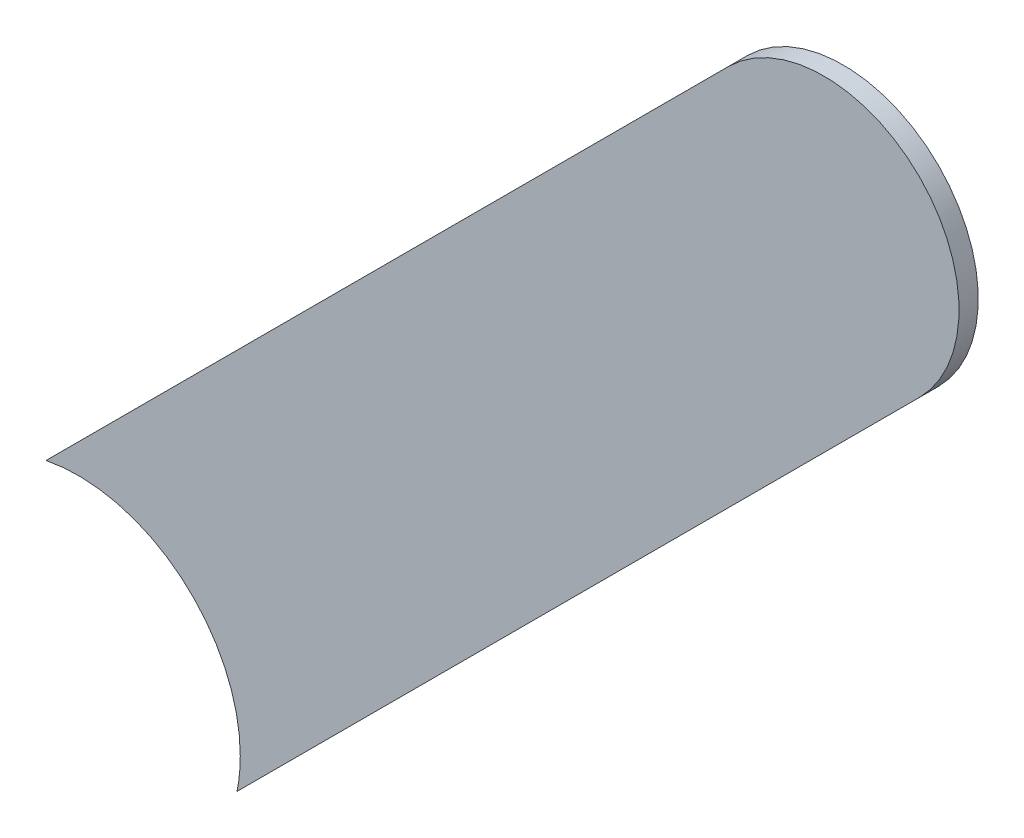
ISO-10303-21;
HEADER;
FILE_DESCRIPTION(('STEP AP214'),'2;1');
FILE_NAME('part.step','',(''),(''),'','','');
FILE_SCHEMA(('AUTOMOTIVE_DESIGN { 1 0 10303 214 1 1 1 1 }'));
ENDSEC;
DATA;
#1=APPLICATION_CONTEXT('core data for automotive mechanical design processes');
#2=APPLICATION_PROTOCOL_DEFINITION('international standard','automotive_design',2000,#1);
#3=PRODUCT_CONTEXT('',#1,'mechanical');
#4=PRODUCT('Part','Part','',(#3));
#5=PRODUCT_RELATED_PRODUCT_CATEGORY('part','',(#4));
#6=PRODUCT_DEFINITION_FORMATION('','',#4);
#7=PRODUCT_DEFINITION_CONTEXT('part definition',#1,'design');
#8=PRODUCT_DEFINITION('design','',#6,#7);
#9=PRODUCT_DEFINITION_SHAPE('','',#8);
#10=(LENGTH_UNIT() NAMED_UNIT(*) SI_UNIT(.MILLI.,.METRE.));
#11=(NAMED_UNIT(*) PLANE_ANGLE_UNIT() SI_UNIT($,.RADIAN.));
#12=(NAMED_UNIT(*) SI_UNIT($,.STERADIAN.) SOLID_ANGLE_UNIT());
#13=UNCERTAINTY_MEASURE_WITH_UNIT(LENGTH_MEASURE(1.E-05),#10,'distance_accuracy_value','');
#14=(GEOMETRIC_REPRESENTATION_CONTEXT(3) GLOBAL_UNCERTAINTY_ASSIGNED_CONTEXT((#13)) GLOBAL_UNIT_ASSIGNED_CONTEXT((#10,
#11,#12)) REPRESENTATION_CONTEXT('',''));
#15=CARTESIAN_POINT('',(0.,0.,0.));
#16=DIRECTION('',(0.,0.,1.));
#17=DIRECTION('',(1.,0.,0.));
#18=AXIS2_PLACEMENT_3D('',#15,#16,#17);
#19=CARTESIAN_POINT('',(110.7740288818,113.240485721801,0.));
#20=DIRECTION('',(-0.707106781186548,0.707106781186548,0.));
#21=DIRECTION('',(0.707106781186548,0.707106781186548,0.));
#22=AXIS2_PLACEMENT_3D('',#19,#20,#21);
#23=PLANE('',#22);
#24=DIRECTION('',(0.707106781186548,0.707106781186548,0.));
#25=VECTOR('',#24,1.);
#26=CARTESIAN_POINT('',(110.65676878,113.12322562,0.03556));
#27=LINE('',#26,#25);
#28=CARTESIAN_POINT('',(110.7740288818,113.240485721801,0.03556));
#29=VERTEX_POINT('',#28);
#30=CARTESIAN_POINT('',(112.03680158,114.50325842,0.03556));
#31=VERTEX_POINT('',#30);
#32=EDGE_CURVE('E11',#29,#31,#27,.T.);
#33=ORIENTED_EDGE('',*,*,#32,.F.);
#34=DIRECTION('',(0.,0.,1.));
#35=VECTOR('',#34,1.);
#36=CARTESIAN_POINT('',(110.7740288818,113.240485721801,0.));
#37=LINE('',#36,#35);
#38=CARTESIAN_POINT('',(110.7740288818,113.240485721801,0.));
#39=VERTEX_POINT('',#38);
#40=EDGE_CURVE('E24',#39,#29,#37,.T.);
#41=ORIENTED_EDGE('',*,*,#40,.F.);
#42=DIRECTION('',(0.707106781186548,0.707106781186548,0.));
#43=VECTOR('',#42,1.);
#44=CARTESIAN_POINT('',(110.65676878,113.12322562,0.));
#45=LINE('',#44,#43);
#46=CARTESIAN_POINT('',(112.03680158,114.50325842,0.));
#47=VERTEX_POINT('',#46);
#48=EDGE_CURVE('E82',#39,#47,#45,.T.);
#49=ORIENTED_EDGE('',*,*,#48,.T.);
#50=DIRECTION('',(0.,0.,1.));
#51=VECTOR('',#50,1.);
#52=CARTESIAN_POINT('',(112.03680158,114.50325842,0.));
#53=LINE('',#52,#51);
#54=EDGE_CURVE('E37',#47,#31,#53,.T.);
#55=ORIENTED_EDGE('',*,*,#54,.T.);
#56=EDGE_LOOP('',(#33,#41,#49,#55));
#57=FACE_BOUND('',#56,.T.);
#58=ADVANCED_FACE('F17',(#57),#23,.F.);
#59=CARTESIAN_POINT('',(111.8600252,114.6800348,0.));
#60=DIRECTION('',(0.,0.,-1.));
#61=DIRECTION('',(0.707106781186548,-0.707106781186548,0.));
#62=AXIS2_PLACEMENT_3D('',#59,#60,#61);
#63=CYLINDRICAL_SURFACE('',#62,0.249999554103209);
#64=CARTESIAN_POINT('',(111.8600252,114.6800348,0.03556));
#65=DIRECTION('',(0.,0.,1.));
#66=DIRECTION('',(0.707106781186548,-0.707106781186548,0.));
#67=AXIS2_PLACEMENT_3D('',#64,#65,#66);
#68=CIRCLE('',#67,0.249999554103209);
#69=CARTESIAN_POINT('',(111.68324882,114.85681118,0.03556));
#70=VERTEX_POINT('',#69);
#71=EDGE_CURVE('E97',#31,#70,#68,.T.);
#72=ORIENTED_EDGE('',*,*,#71,.F.);
#73=ORIENTED_EDGE('',*,*,#54,.F.);
#74=CARTESIAN_POINT('',(111.8600252,114.6800348,0.));
#75=DIRECTION('',(0.,0.,1.));
#76=DIRECTION('',(0.707106781186548,-0.707106781186548,0.));
#77=AXIS2_PLACEMENT_3D('',#74,#75,#76);
#78=CIRCLE('',#77,0.249999554103209);
#79=CARTESIAN_POINT('',(111.68324882,114.85681118,0.));
#80=VERTEX_POINT('',#79);
#81=EDGE_CURVE('E94',#47,#80,#78,.T.);
#82=ORIENTED_EDGE('',*,*,#81,.T.);
#83=DIRECTION('',(0.,0.,1.));
#84=VECTOR('',#83,1.);
#85=CARTESIAN_POINT('',(111.68324882,114.85681118,0.));
#86=LINE('',#85,#84);
#87=EDGE_CURVE('E92',#80,#70,#86,.T.);
#88=ORIENTED_EDGE('',*,*,#87,.T.);
#89=EDGE_LOOP('',(#72,#73,#82,#88));
#90=FACE_BOUND('',#89,.T.);
#91=ADVANCED_FACE('F103',(#90),#63,.T.);
#92=CARTESIAN_POINT('',(111.68324882,114.85681118,0.));
#93=DIRECTION('',(0.707106781186548,-0.707106781186548,0.));
#94=DIRECTION('',(-0.707106781186548,-0.707106781186548,0.));
#95=AXIS2_PLACEMENT_3D('',#92,#93,#94);
#96=PLANE('',#95);
#97=DIRECTION('',(-0.707106781186548,-0.707106781186548,0.));
#98=VECTOR('',#97,1.);
#99=CARTESIAN_POINT('',(111.68324882,114.85681118,0.03556));
#100=LINE('',#99,#98);
#101=CARTESIAN_POINT('',(110.420476121801,113.594038481801,0.03556));
#102=VERTEX_POINT('',#101);
#103=EDGE_CURVE('E89',#70,#102,#100,.T.);
#104=ORIENTED_EDGE('',*,*,#103,.F.);
#105=ORIENTED_EDGE('',*,*,#87,.F.);
#106=DIRECTION('',(-0.707106781186548,-0.707106781186548,0.));
#107=VECTOR('',#106,1.);
#108=CARTESIAN_POINT('',(111.68324882,114.85681118,0.));
#109=LINE('',#108,#107);
#110=CARTESIAN_POINT('',(110.420476121801,113.594038481801,0.));
#111=VERTEX_POINT('',#110);
#112=EDGE_CURVE('E87',#80,#111,#109,.T.);
#113=ORIENTED_EDGE('',*,*,#112,.T.);
#114=DIRECTION('',(0.,0.,1.));
#115=VECTOR('',#114,1.);
#116=CARTESIAN_POINT('',(110.420476121801,113.594038481801,0.));
#117=LINE('',#116,#115);
#118=EDGE_CURVE('E69',#111,#102,#117,.T.);
#119=ORIENTED_EDGE('',*,*,#118,.T.);
#120=EDGE_LOOP('',(#104,#105,#113,#119));
#121=FACE_BOUND('',#120,.T.);
#122=ADVANCED_FACE('F108',(#121),#96,.F.);
#123=CARTESIAN_POINT('',(110.4799924,113.300002,0.));
#124=DIRECTION('',(0.,0.,-1.));
#125=DIRECTION('',(1.,0.,0.));
#126=AXIS2_PLACEMENT_3D('',#123,#124,#125);
#127=CYLINDRICAL_SURFACE('',#126,0.2999994);
#128=DIRECTION('',(0.,0.,1.));
#129=VECTOR('',#128,1.);
#130=CARTESIAN_POINT('',(110.7799918,113.300002,0.));
#131=LINE('',#130,#129);
#132=CARTESIAN_POINT('',(110.7799918,113.300002,0.));
#133=VERTEX_POINT('',#132);
#134=CARTESIAN_POINT('',(110.7799918,113.300002,0.03556));
#135=VERTEX_POINT('',#134);
#136=EDGE_CURVE('E59',#133,#135,#131,.T.);
#137=ORIENTED_EDGE('',*,*,#136,.T.);
#138=CARTESIAN_POINT('',(110.4799924,113.300002,0.03556));
#139=DIRECTION('',(0.,0.,1.));
#140=DIRECTION('',(1.,0.,0.));
#141=AXIS2_PLACEMENT_3D('',#138,#139,#140);
#142=CIRCLE('',#141,0.2999994);
#143=EDGE_CURVE('E70',#135,#102,#142,.T.);
#144=ORIENTED_EDGE('',*,*,#143,.T.);
#145=ORIENTED_EDGE('',*,*,#118,.F.);
#146=CARTESIAN_POINT('',(110.4799924,113.300002,0.));
#147=DIRECTION('',(0.,0.,1.));
#148=DIRECTION('',(1.,0.,0.));
#149=AXIS2_PLACEMENT_3D('',#146,#147,#148);
#150=CIRCLE('',#149,0.2999994);
#151=EDGE_CURVE('E73',#133,#111,#150,.T.);
#152=ORIENTED_EDGE('',*,*,#151,.F.);
#153=EDGE_LOOP('',(#137,#144,#145,#152));
#154=FACE_BOUND('',#153,.T.);
#155=ADVANCED_FACE('F74',(#154),#127,.F.);
#156=CARTESIAN_POINT('',(110.4799924,113.300002,0.));
#157=DIRECTION('',(0.,0.,-1.));
#158=DIRECTION('',(1.,0.,0.));
#159=AXIS2_PLACEMENT_3D('',#156,#157,#158);
#160=CYLINDRICAL_SURFACE('',#159,0.2999994);
#161=ORIENTED_EDGE('',*,*,#40,.T.);
#162=CARTESIAN_POINT('',(110.4799924,113.300002,0.03556));
#163=DIRECTION('',(0.,0.,1.));
#164=DIRECTION('',(1.,0.,0.));
#165=AXIS2_PLACEMENT_3D('',#162,#163,#164);
#166=CIRCLE('',#165,0.2999994);
#167=EDGE_CURVE('E65',#29,#135,#166,.T.);
#168=ORIENTED_EDGE('',*,*,#167,.T.);
#169=ORIENTED_EDGE('',*,*,#136,.F.);
#170=EDGE_CURVE('E63',#39,#133,#150,.T.);
#171=ORIENTED_EDGE('',*,*,#170,.F.);
#172=EDGE_LOOP('',(#161,#168,#169,#171));
#173=FACE_BOUND('',#172,.T.);
#174=ADVANCED_FACE('F61',(#173),#160,.F.);
#175=CARTESIAN_POINT('',(110.65676878,113.12322562,0.));
#176=DIRECTION('',(0.,0.,-1.));
#177=DIRECTION('',(-1.,0.,0.));
#178=AXIS2_PLACEMENT_3D('',#175,#176,#177);
#179=PLANE('',#178);
#180=ORIENTED_EDGE('',*,*,#48,.F.);
#181=ORIENTED_EDGE('',*,*,#170,.T.);
#182=ORIENTED_EDGE('',*,*,#151,.T.);
#183=ORIENTED_EDGE('',*,*,#112,.F.);
#184=ORIENTED_EDGE('',*,*,#81,.F.);
#185=EDGE_LOOP('',(#180,#181,#182,#183,#184));
#186=FACE_BOUND('',#185,.T.);
#187=ADVANCED_FACE('F80',(#186),#179,.T.);
#188=CARTESIAN_POINT('',(110.65676878,113.12322562,0.03556));
#189=DIRECTION('',(0.,0.,-1.));
#190=DIRECTION('',(-1.,0.,0.));
#191=AXIS2_PLACEMENT_3D('',#188,#189,#190);
#192=PLANE('',#191);
#193=ORIENTED_EDGE('',*,*,#167,.F.);
#194=ORIENTED_EDGE('',*,*,#32,.T.);
#195=ORIENTED_EDGE('',*,*,#71,.T.);
#196=ORIENTED_EDGE('',*,*,#103,.T.);
#197=ORIENTED_EDGE('',*,*,#143,.F.);
#198=EDGE_LOOP('',(#193,#194,#195,#196,#197));
#199=FACE_BOUND('',#198,.T.);
#200=ADVANCED_FACE('F106',(#199),#192,.F.);
#201=CLOSED_SHELL('',(#58,#91,#122,#155,#174,#187,#200));
#202=MANIFOLD_SOLID_BREP('B1',#201);
#203=ADVANCED_BREP_SHAPE_REPRESENTATION('',(#18,#202),#14);
#204=SHAPE_DEFINITION_REPRESENTATION(#9,#203);
ENDSEC;
END-ISO-10303-21;
